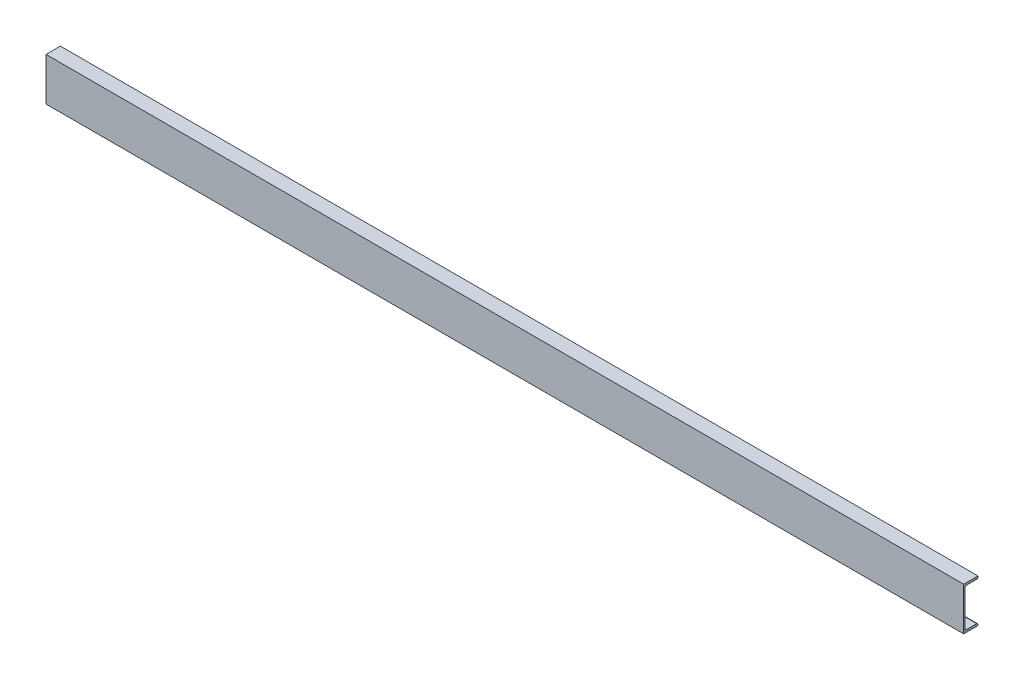
ISO-10303-21;
HEADER;
FILE_DESCRIPTION(('STEP AP214'),'2;1');
FILE_NAME('part.step','',(''),(''),'','','');
FILE_SCHEMA(('AUTOMOTIVE_DESIGN { 1 0 10303 214 1 1 1 1 }'));
ENDSEC;
DATA;
#1=APPLICATION_CONTEXT('core data for automotive mechanical design processes');
#2=APPLICATION_PROTOCOL_DEFINITION('international standard','automotive_design',2000,#1);
#3=PRODUCT_CONTEXT('',#1,'mechanical');
#4=PRODUCT('Part','Part','',(#3));
#5=PRODUCT_RELATED_PRODUCT_CATEGORY('part','',(#4));
#6=PRODUCT_DEFINITION_FORMATION('','',#4);
#7=PRODUCT_DEFINITION_CONTEXT('part definition',#1,'design');
#8=PRODUCT_DEFINITION('design','',#6,#7);
#9=PRODUCT_DEFINITION_SHAPE('','',#8);
#10=(LENGTH_UNIT() NAMED_UNIT(*) SI_UNIT(.MILLI.,.METRE.));
#11=(NAMED_UNIT(*) PLANE_ANGLE_UNIT() SI_UNIT($,.RADIAN.));
#12=(NAMED_UNIT(*) SI_UNIT($,.STERADIAN.) SOLID_ANGLE_UNIT());
#13=UNCERTAINTY_MEASURE_WITH_UNIT(LENGTH_MEASURE(1.E-05),#10,'distance_accuracy_value','');
#14=(GEOMETRIC_REPRESENTATION_CONTEXT(3) GLOBAL_UNCERTAINTY_ASSIGNED_CONTEXT((#13)) GLOBAL_UNIT_ASSIGNED_CONTEXT((#10,
#11,#12)) REPRESENTATION_CONTEXT('',''));
#15=CARTESIAN_POINT('',(0.,0.,0.));
#16=DIRECTION('',(0.,0.,1.));
#17=DIRECTION('',(1.,0.,0.));
#18=AXIS2_PLACEMENT_3D('',#15,#16,#17);
#19=CARTESIAN_POINT('',(6400.,107.879598662207,86.6220735785954));
#20=DIRECTION('',(0.,0.,1.));
#21=DIRECTION('',(1.,0.,0.));
#22=AXIS2_PLACEMENT_3D('',#19,#20,#21);
#23=PLANE('',#22);
#24=DIRECTION('',(0.,1.,0.));
#25=VECTOR('',#24,1.);
#26=CARTESIAN_POINT('',(0.,107.879598662207,86.6220735785954));
#27=LINE('',#26,#25);
#28=CARTESIAN_POINT('',(0.,107.879598662207,86.6220735785954));
#29=VERTEX_POINT('',#28);
#30=CARTESIAN_POINT('',(0.,113.879598662207,86.6220735785954));
#31=VERTEX_POINT('',#30);
#32=EDGE_CURVE('E152',#29,#31,#27,.T.);
#33=ORIENTED_EDGE('',*,*,#32,.T.);
#34=DIRECTION('',(-1.,0.,0.));
#35=VECTOR('',#34,1.);
#36=CARTESIAN_POINT('',(6400.,113.879598662207,86.6220735785954));
#37=LINE('',#36,#35);
#38=CARTESIAN_POINT('',(6400.,113.879598662207,86.6220735785954));
#39=VERTEX_POINT('',#38);
#40=EDGE_CURVE('E11',#39,#31,#37,.T.);
#41=ORIENTED_EDGE('',*,*,#40,.F.);
#42=DIRECTION('',(0.,1.,0.));
#43=VECTOR('',#42,1.);
#44=CARTESIAN_POINT('',(6400.,107.879598662207,86.6220735785954));
#45=LINE('',#44,#43);
#46=CARTESIAN_POINT('',(6400.,107.879598662207,86.6220735785954));
#47=VERTEX_POINT('',#46);
#48=EDGE_CURVE('E174',#47,#39,#45,.T.);
#49=ORIENTED_EDGE('',*,*,#48,.F.);
#50=DIRECTION('',(-1.,0.,0.));
#51=VECTOR('',#50,1.);
#52=CARTESIAN_POINT('',(6400.,107.879598662207,86.6220735785954));
#53=LINE('',#52,#51);
#54=EDGE_CURVE('E148',#47,#29,#53,.T.);
#55=ORIENTED_EDGE('',*,*,#54,.T.);
#56=EDGE_LOOP('',(#33,#41,#49,#55));
#57=FACE_BOUND('',#56,.T.);
#58=ADVANCED_FACE('F32',(#57),#23,.F.);
#59=CARTESIAN_POINT('',(6400.,113.879598662207,86.6220735785954));
#60=DIRECTION('',(0.,-1.,0.));
#61=DIRECTION('',(0.,0.,-1.));
#62=AXIS2_PLACEMENT_3D('',#59,#60,#61);
#63=PLANE('',#62);
#64=DIRECTION('',(0.,0.,1.));
#65=VECTOR('',#64,1.);
#66=CARTESIAN_POINT('',(0.,113.879598662207,86.6220735785954));
#67=LINE('',#66,#65);
#68=CARTESIAN_POINT('',(0.,113.879598662207,186.622073578595));
#69=VERTEX_POINT('',#68);
#70=EDGE_CURVE('E155',#31,#69,#67,.T.);
#71=ORIENTED_EDGE('',*,*,#70,.T.);
#72=DIRECTION('',(-1.,0.,0.));
#73=VECTOR('',#72,1.);
#74=CARTESIAN_POINT('',(6400.,113.879598662207,186.622073578595));
#75=LINE('',#74,#73);
#76=CARTESIAN_POINT('',(6400.,113.879598662207,186.622073578595));
#77=VERTEX_POINT('',#76);
#78=EDGE_CURVE('E40',#77,#69,#75,.T.);
#79=ORIENTED_EDGE('',*,*,#78,.F.);
#80=DIRECTION('',(0.,0.,1.));
#81=VECTOR('',#80,1.);
#82=CARTESIAN_POINT('',(6400.,113.879598662207,86.6220735785954));
#83=LINE('',#82,#81);
#84=EDGE_CURVE('E103',#39,#77,#83,.T.);
#85=ORIENTED_EDGE('',*,*,#84,.F.);
#86=ORIENTED_EDGE('',*,*,#40,.T.);
#87=EDGE_LOOP('',(#71,#79,#85,#86));
#88=FACE_BOUND('',#87,.T.);
#89=ADVANCED_FACE('F252',(#88),#63,.F.);
#90=CARTESIAN_POINT('',(6400.,113.879598662207,186.622073578595));
#91=DIRECTION('',(0.,0.,-1.));
#92=DIRECTION('',(-1.,0.,0.));
#93=AXIS2_PLACEMENT_3D('',#90,#91,#92);
#94=PLANE('',#93);
#95=DIRECTION('',(0.,-1.,0.));
#96=VECTOR('',#95,1.);
#97=CARTESIAN_POINT('',(0.,113.879598662207,186.622073578595));
#98=LINE('',#97,#96);
#99=CARTESIAN_POINT('',(0.,-186.120401337793,186.622073578595));
#100=VERTEX_POINT('',#99);
#101=EDGE_CURVE('E157',#69,#100,#98,.T.);
#102=ORIENTED_EDGE('',*,*,#101,.T.);
#103=DIRECTION('',(-1.,0.,0.));
#104=VECTOR('',#103,1.);
#105=CARTESIAN_POINT('',(6400.,-186.120401337793,186.622073578595));
#106=LINE('',#105,#104);
#107=CARTESIAN_POINT('',(6400.,-186.120401337793,186.622073578595));
#108=VERTEX_POINT('',#107);
#109=EDGE_CURVE('E193',#108,#100,#106,.T.);
#110=ORIENTED_EDGE('',*,*,#109,.F.);
#111=DIRECTION('',(0.,-1.,0.));
#112=VECTOR('',#111,1.);
#113=CARTESIAN_POINT('',(6400.,113.879598662207,186.622073578595));
#114=LINE('',#113,#112);
#115=EDGE_CURVE('E201',#77,#108,#114,.T.);
#116=ORIENTED_EDGE('',*,*,#115,.F.);
#117=ORIENTED_EDGE('',*,*,#78,.T.);
#118=EDGE_LOOP('',(#102,#110,#116,#117));
#119=FACE_BOUND('',#118,.T.);
#120=ADVANCED_FACE('F199',(#119),#94,.F.);
#121=CARTESIAN_POINT('',(6400.,-186.120401337793,186.622073578595));
#122=DIRECTION('',(0.,1.,0.));
#123=DIRECTION('',(0.,0.,1.));
#124=AXIS2_PLACEMENT_3D('',#121,#122,#123);
#125=PLANE('',#124);
#126=DIRECTION('',(0.,0.,-1.));
#127=VECTOR('',#126,1.);
#128=CARTESIAN_POINT('',(0.,-186.120401337793,186.622073578595));
#129=LINE('',#128,#127);
#130=CARTESIAN_POINT('',(0.,-186.120401337793,86.6220735785954));
#131=VERTEX_POINT('',#130);
#132=EDGE_CURVE('E159',#100,#131,#129,.T.);
#133=ORIENTED_EDGE('',*,*,#132,.T.);
#134=DIRECTION('',(-1.,0.,0.));
#135=VECTOR('',#134,1.);
#136=CARTESIAN_POINT('',(6400.,-186.120401337793,86.6220735785954));
#137=LINE('',#136,#135);
#138=CARTESIAN_POINT('',(6400.,-186.120401337793,86.6220735785954));
#139=VERTEX_POINT('',#138);
#140=EDGE_CURVE('E190',#139,#131,#137,.T.);
#141=ORIENTED_EDGE('',*,*,#140,.F.);
#142=DIRECTION('',(0.,0.,-1.));
#143=VECTOR('',#142,1.);
#144=CARTESIAN_POINT('',(6400.,-186.120401337793,186.622073578595));
#145=LINE('',#144,#143);
#146=EDGE_CURVE('E219',#108,#139,#145,.T.);
#147=ORIENTED_EDGE('',*,*,#146,.F.);
#148=ORIENTED_EDGE('',*,*,#109,.T.);
#149=EDGE_LOOP('',(#133,#141,#147,#148));
#150=FACE_BOUND('',#149,.T.);
#151=ADVANCED_FACE('F210',(#150),#125,.F.);
#152=CARTESIAN_POINT('',(6400.,-186.120401337793,86.6220735785954));
#153=DIRECTION('',(0.,0.,1.));
#154=DIRECTION('',(1.,0.,0.));
#155=AXIS2_PLACEMENT_3D('',#152,#153,#154);
#156=PLANE('',#155);
#157=DIRECTION('',(0.,1.,0.));
#158=VECTOR('',#157,1.);
#159=CARTESIAN_POINT('',(0.,-186.120401337793,86.6220735785954));
#160=LINE('',#159,#158);
#161=CARTESIAN_POINT('',(0.,-180.120401337793,86.6220735785954));
#162=VERTEX_POINT('',#161);
#163=EDGE_CURVE('E161',#131,#162,#160,.T.);
#164=ORIENTED_EDGE('',*,*,#163,.T.);
#165=DIRECTION('',(-1.,0.,0.));
#166=VECTOR('',#165,1.);
#167=CARTESIAN_POINT('',(6400.,-180.120401337793,86.6220735785954));
#168=LINE('',#167,#166);
#169=CARTESIAN_POINT('',(6400.,-180.120401337793,86.6220735785954));
#170=VERTEX_POINT('',#169);
#171=EDGE_CURVE('E187',#170,#162,#168,.T.);
#172=ORIENTED_EDGE('',*,*,#171,.F.);
#173=DIRECTION('',(0.,1.,0.));
#174=VECTOR('',#173,1.);
#175=CARTESIAN_POINT('',(6400.,-186.120401337793,86.6220735785954));
#176=LINE('',#175,#174);
#177=EDGE_CURVE('E216',#139,#170,#176,.T.);
#178=ORIENTED_EDGE('',*,*,#177,.F.);
#179=ORIENTED_EDGE('',*,*,#140,.T.);
#180=EDGE_LOOP('',(#164,#172,#178,#179));
#181=FACE_BOUND('',#180,.T.);
#182=ADVANCED_FACE('F214',(#181),#156,.F.);
#183=CARTESIAN_POINT('',(6400.,-180.120401337793,96.6220735785954));
#184=DIRECTION('',(-1.,0.,0.));
#185=DIRECTION('',(0.,0.,1.));
#186=AXIS2_PLACEMENT_3D('',#183,#184,#185);
#187=CYLINDRICAL_SURFACE('',#186,10.);
#188=CARTESIAN_POINT('',(0.,-180.120401337793,96.6220735785954));
#189=DIRECTION('',(1.,0.,0.));
#190=DIRECTION('',(0.,0.,-1.));
#191=AXIS2_PLACEMENT_3D('',#188,#189,#190);
#192=CIRCLE('',#191,10.);
#193=CARTESIAN_POINT('',(0.,-170.120401337793,96.6220735785954));
#194=VERTEX_POINT('',#193);
#195=EDGE_CURVE('E163',#162,#194,#192,.T.);
#196=ORIENTED_EDGE('',*,*,#195,.T.);
#197=DIRECTION('',(-1.,0.,0.));
#198=VECTOR('',#197,1.);
#199=CARTESIAN_POINT('',(6400.,-170.120401337793,96.6220735785954));
#200=LINE('',#199,#198);
#201=CARTESIAN_POINT('',(6400.,-170.120401337793,96.6220735785954));
#202=VERTEX_POINT('',#201);
#203=EDGE_CURVE('E184',#202,#194,#200,.T.);
#204=ORIENTED_EDGE('',*,*,#203,.F.);
#205=CARTESIAN_POINT('',(6400.,-180.120401337793,96.6220735785954));
#206=DIRECTION('',(1.,0.,0.));
#207=DIRECTION('',(0.,0.,-1.));
#208=AXIS2_PLACEMENT_3D('',#205,#206,#207);
#209=CIRCLE('',#208,10.);
#210=EDGE_CURVE('E218',#170,#202,#209,.T.);
#211=ORIENTED_EDGE('',*,*,#210,.F.);
#212=ORIENTED_EDGE('',*,*,#171,.T.);
#213=EDGE_LOOP('',(#196,#204,#211,#212));
#214=FACE_BOUND('',#213,.T.);
#215=ADVANCED_FACE('F265',(#214),#187,.T.);
#216=CARTESIAN_POINT('',(6400.,-170.120401337793,96.6220735785954));
#217=DIRECTION('',(0.,-1.,0.));
#218=DIRECTION('',(0.,0.,-1.));
#219=AXIS2_PLACEMENT_3D('',#216,#217,#218);
#220=PLANE('',#219);
#221=DIRECTION('',(0.,0.,1.));
#222=VECTOR('',#221,1.);
#223=CARTESIAN_POINT('',(0.,-170.120401337793,96.6220735785954));
#224=LINE('',#223,#222);
#225=CARTESIAN_POINT('',(0.,-170.120401337793,166.622073578595));
#226=VERTEX_POINT('',#225);
#227=EDGE_CURVE('E165',#194,#226,#224,.T.);
#228=ORIENTED_EDGE('',*,*,#227,.T.);
#229=DIRECTION('',(-1.,0.,0.));
#230=VECTOR('',#229,1.);
#231=CARTESIAN_POINT('',(6400.,-170.120401337793,166.622073578595));
#232=LINE('',#231,#230);
#233=CARTESIAN_POINT('',(6400.,-170.120401337793,166.622073578595));
#234=VERTEX_POINT('',#233);
#235=EDGE_CURVE('E181',#234,#226,#232,.T.);
#236=ORIENTED_EDGE('',*,*,#235,.F.);
#237=DIRECTION('',(0.,0.,1.));
#238=VECTOR('',#237,1.);
#239=CARTESIAN_POINT('',(6400.,-170.120401337793,96.6220735785954));
#240=LINE('',#239,#238);
#241=EDGE_CURVE('E221',#202,#234,#240,.T.);
#242=ORIENTED_EDGE('',*,*,#241,.F.);
#243=ORIENTED_EDGE('',*,*,#203,.T.);
#244=EDGE_LOOP('',(#228,#236,#242,#243));
#245=FACE_BOUND('',#244,.T.);
#246=ADVANCED_FACE('F268',(#245),#220,.F.);
#247=CARTESIAN_POINT('',(6400.,-160.120401337793,166.622073578595));
#248=DIRECTION('',(-1.,0.,0.));
#249=DIRECTION('',(0.,0.,1.));
#250=AXIS2_PLACEMENT_3D('',#247,#248,#249);
#251=CYLINDRICAL_SURFACE('',#250,10.);
#252=CARTESIAN_POINT('',(0.,-160.120401337793,166.622073578595));
#253=DIRECTION('',(-1.,0.,0.));
#254=DIRECTION('',(0.,0.,1.));
#255=AXIS2_PLACEMENT_3D('',#252,#253,#254);
#256=CIRCLE('',#255,10.);
#257=CARTESIAN_POINT('',(0.,-160.120401337793,176.622073578595));
#258=VERTEX_POINT('',#257);
#259=EDGE_CURVE('E167',#226,#258,#256,.T.);
#260=ORIENTED_EDGE('',*,*,#259,.T.);
#261=DIRECTION('',(-1.,0.,0.));
#262=VECTOR('',#261,1.);
#263=CARTESIAN_POINT('',(6400.,-160.120401337793,176.622073578595));
#264=LINE('',#263,#262);
#265=CARTESIAN_POINT('',(6400.,-160.120401337793,176.622073578595));
#266=VERTEX_POINT('',#265);
#267=EDGE_CURVE('E178',#266,#258,#264,.T.);
#268=ORIENTED_EDGE('',*,*,#267,.F.);
#269=CARTESIAN_POINT('',(6400.,-160.120401337793,166.622073578595));
#270=DIRECTION('',(-1.,0.,0.));
#271=DIRECTION('',(0.,0.,1.));
#272=AXIS2_PLACEMENT_3D('',#269,#270,#271);
#273=CIRCLE('',#272,10.);
#274=EDGE_CURVE('E227',#234,#266,#273,.T.);
#275=ORIENTED_EDGE('',*,*,#274,.F.);
#276=ORIENTED_EDGE('',*,*,#235,.T.);
#277=EDGE_LOOP('',(#260,#268,#275,#276));
#278=FACE_BOUND('',#277,.T.);
#279=ADVANCED_FACE('F233',(#278),#251,.F.);
#280=CARTESIAN_POINT('',(6400.,-160.120401337793,176.622073578595));
#281=DIRECTION('',(0.,0.,1.));
#282=DIRECTION('',(0.,-1.,0.));
#283=AXIS2_PLACEMENT_3D('',#280,#281,#282);
#284=PLANE('',#283);
#285=DIRECTION('',(0.,1.,0.));
#286=VECTOR('',#285,1.);
#287=CARTESIAN_POINT('',(0.,-160.120401337793,176.622073578595));
#288=LINE('',#287,#286);
#289=CARTESIAN_POINT('',(0.,87.8795986622073,176.622073578595));
#290=VERTEX_POINT('',#289);
#291=EDGE_CURVE('E169',#258,#290,#288,.T.);
#292=ORIENTED_EDGE('',*,*,#291,.T.);
#293=DIRECTION('',(-1.,0.,0.));
#294=VECTOR('',#293,1.);
#295=CARTESIAN_POINT('',(6400.,87.8795986622073,176.622073578595));
#296=LINE('',#295,#294);
#297=CARTESIAN_POINT('',(6400.,87.8795986622073,176.622073578595));
#298=VERTEX_POINT('',#297);
#299=EDGE_CURVE('E143',#298,#290,#296,.T.);
#300=ORIENTED_EDGE('',*,*,#299,.F.);
#301=DIRECTION('',(0.,1.,0.));
#302=VECTOR('',#301,1.);
#303=CARTESIAN_POINT('',(6400.,-160.120401337793,176.622073578595));
#304=LINE('',#303,#302);
#305=EDGE_CURVE('E134',#266,#298,#304,.T.);
#306=ORIENTED_EDGE('',*,*,#305,.F.);
#307=ORIENTED_EDGE('',*,*,#267,.T.);
#308=EDGE_LOOP('',(#292,#300,#306,#307));
#309=FACE_BOUND('',#308,.T.);
#310=ADVANCED_FACE('F237',(#309),#284,.F.);
#311=CARTESIAN_POINT('',(6400.,87.8795986622074,166.622073578595));
#312=DIRECTION('',(-1.,0.,0.));
#313=DIRECTION('',(0.,0.,1.));
#314=AXIS2_PLACEMENT_3D('',#311,#312,#313);
#315=CYLINDRICAL_SURFACE('',#314,10.);
#316=CARTESIAN_POINT('',(0.,87.8795986622074,166.622073578595));
#317=DIRECTION('',(-1.,0.,0.));
#318=DIRECTION('',(0.,0.,1.));
#319=AXIS2_PLACEMENT_3D('',#316,#317,#318);
#320=CIRCLE('',#319,10.);
#321=CARTESIAN_POINT('',(0.,97.8795986622074,166.622073578595));
#322=VERTEX_POINT('',#321);
#323=EDGE_CURVE('E142',#290,#322,#320,.T.);
#324=ORIENTED_EDGE('',*,*,#323,.T.);
#325=DIRECTION('',(-1.,0.,0.));
#326=VECTOR('',#325,1.);
#327=CARTESIAN_POINT('',(6400.,97.8795986622074,166.622073578595));
#328=LINE('',#327,#326);
#329=CARTESIAN_POINT('',(6400.,97.8795986622074,166.622073578595));
#330=VERTEX_POINT('',#329);
#331=EDGE_CURVE('E139',#330,#322,#328,.T.);
#332=ORIENTED_EDGE('',*,*,#331,.F.);
#333=CARTESIAN_POINT('',(6400.,87.8795986622074,166.622073578595));
#334=DIRECTION('',(-1.,0.,0.));
#335=DIRECTION('',(0.,0.,1.));
#336=AXIS2_PLACEMENT_3D('',#333,#334,#335);
#337=CIRCLE('',#336,10.);
#338=EDGE_CURVE('E128',#298,#330,#337,.T.);
#339=ORIENTED_EDGE('',*,*,#338,.F.);
#340=ORIENTED_EDGE('',*,*,#299,.T.);
#341=EDGE_LOOP('',(#324,#332,#339,#340));
#342=FACE_BOUND('',#341,.T.);
#343=ADVANCED_FACE('F140',(#342),#315,.F.);
#344=CARTESIAN_POINT('',(6400.,97.8795986622074,166.622073578595));
#345=DIRECTION('',(0.,1.,0.));
#346=DIRECTION('',(0.,0.,1.));
#347=AXIS2_PLACEMENT_3D('',#344,#345,#346);
#348=PLANE('',#347);
#349=DIRECTION('',(0.,0.,-1.));
#350=VECTOR('',#349,1.);
#351=CARTESIAN_POINT('',(0.,97.8795986622074,166.622073578595));
#352=LINE('',#351,#350);
#353=CARTESIAN_POINT('',(0.,97.8795986622074,96.6220735785955));
#354=VERTEX_POINT('',#353);
#355=EDGE_CURVE('E89',#322,#354,#352,.T.);
#356=ORIENTED_EDGE('',*,*,#355,.T.);
#357=DIRECTION('',(-1.,0.,0.));
#358=VECTOR('',#357,1.);
#359=CARTESIAN_POINT('',(6400.,97.8795986622074,96.6220735785955));
#360=LINE('',#359,#358);
#361=CARTESIAN_POINT('',(6400.,97.8795986622074,96.6220735785955));
#362=VERTEX_POINT('',#361);
#363=EDGE_CURVE('E144',#362,#354,#360,.T.);
#364=ORIENTED_EDGE('',*,*,#363,.F.);
#365=DIRECTION('',(0.,0.,-1.));
#366=VECTOR('',#365,1.);
#367=CARTESIAN_POINT('',(6400.,97.8795986622074,166.622073578595));
#368=LINE('',#367,#366);
#369=EDGE_CURVE('E132',#330,#362,#368,.T.);
#370=ORIENTED_EDGE('',*,*,#369,.F.);
#371=ORIENTED_EDGE('',*,*,#331,.T.);
#372=EDGE_LOOP('',(#356,#364,#370,#371));
#373=FACE_BOUND('',#372,.T.);
#374=ADVANCED_FACE('F146',(#373),#348,.F.);
#375=CARTESIAN_POINT('',(6400.,107.879598662207,96.6220735785954));
#376=DIRECTION('',(-1.,0.,0.));
#377=DIRECTION('',(0.,0.,1.));
#378=AXIS2_PLACEMENT_3D('',#375,#376,#377);
#379=CYLINDRICAL_SURFACE('',#378,9.99999999999999);
#380=CARTESIAN_POINT('',(0.,107.879598662207,96.6220735785954));
#381=DIRECTION('',(1.,0.,0.));
#382=DIRECTION('',(0.,0.,-1.));
#383=AXIS2_PLACEMENT_3D('',#380,#381,#382);
#384=CIRCLE('',#383,9.99999999999999);
#385=EDGE_CURVE('E95',#354,#29,#384,.T.);
#386=ORIENTED_EDGE('',*,*,#385,.T.);
#387=ORIENTED_EDGE('',*,*,#54,.F.);
#388=CARTESIAN_POINT('',(6400.,107.879598662207,96.6220735785954));
#389=DIRECTION('',(1.,0.,0.));
#390=DIRECTION('',(0.,0.,-1.));
#391=AXIS2_PLACEMENT_3D('',#388,#389,#390);
#392=CIRCLE('',#391,9.99999999999999);
#393=EDGE_CURVE('E48',#362,#47,#392,.T.);
#394=ORIENTED_EDGE('',*,*,#393,.F.);
#395=ORIENTED_EDGE('',*,*,#363,.T.);
#396=EDGE_LOOP('',(#386,#387,#394,#395));
#397=FACE_BOUND('',#396,.T.);
#398=ADVANCED_FACE('F241',(#397),#379,.T.);
#399=CARTESIAN_POINT('',(6400.,-180.120401337793,96.6220735785954));
#400=DIRECTION('',(1.,0.,0.));
#401=DIRECTION('',(0.,0.,-1.));
#402=AXIS2_PLACEMENT_3D('',#399,#400,#401);
#403=PLANE('',#402);
#404=ORIENTED_EDGE('',*,*,#48,.T.);
#405=ORIENTED_EDGE('',*,*,#84,.T.);
#406=ORIENTED_EDGE('',*,*,#115,.T.);
#407=ORIENTED_EDGE('',*,*,#146,.T.);
#408=ORIENTED_EDGE('',*,*,#177,.T.);
#409=ORIENTED_EDGE('',*,*,#210,.T.);
#410=ORIENTED_EDGE('',*,*,#241,.T.);
#411=ORIENTED_EDGE('',*,*,#274,.T.);
#412=ORIENTED_EDGE('',*,*,#305,.T.);
#413=ORIENTED_EDGE('',*,*,#338,.T.);
#414=ORIENTED_EDGE('',*,*,#369,.T.);
#415=ORIENTED_EDGE('',*,*,#393,.T.);
#416=EDGE_LOOP('',(#404,#405,#406,#407,#408,#409,#410,#411,#412,#413,#414,#415));
#417=FACE_BOUND('',#416,.T.);
#418=ADVANCED_FACE('F130',(#417),#403,.T.);
#419=CARTESIAN_POINT('',(0.,-180.120401337793,96.6220735785954));
#420=DIRECTION('',(1.,0.,0.));
#421=DIRECTION('',(0.,0.,-1.));
#422=AXIS2_PLACEMENT_3D('',#419,#420,#421);
#423=PLANE('',#422);
#424=ORIENTED_EDGE('',*,*,#32,.F.);
#425=ORIENTED_EDGE('',*,*,#385,.F.);
#426=ORIENTED_EDGE('',*,*,#355,.F.);
#427=ORIENTED_EDGE('',*,*,#323,.F.);
#428=ORIENTED_EDGE('',*,*,#291,.F.);
#429=ORIENTED_EDGE('',*,*,#259,.F.);
#430=ORIENTED_EDGE('',*,*,#227,.F.);
#431=ORIENTED_EDGE('',*,*,#195,.F.);
#432=ORIENTED_EDGE('',*,*,#163,.F.);
#433=ORIENTED_EDGE('',*,*,#132,.F.);
#434=ORIENTED_EDGE('',*,*,#101,.F.);
#435=ORIENTED_EDGE('',*,*,#70,.F.);
#436=EDGE_LOOP('',(#424,#425,#426,#427,#428,#429,#430,#431,#432,#433,#434,#435));
#437=FACE_BOUND('',#436,.T.);
#438=ADVANCED_FACE('F205',(#437),#423,.F.);
#439=CLOSED_SHELL('',(#58,#89,#120,#151,#182,#215,#246,#279,#310,#343,#374,#398,#418,#438));
#440=MANIFOLD_SOLID_BREP('B2',#439);
#441=ADVANCED_BREP_SHAPE_REPRESENTATION('',(#18,#440),#14);
#442=SHAPE_DEFINITION_REPRESENTATION(#9,#441);
ENDSEC;
END-ISO-10303-21;
